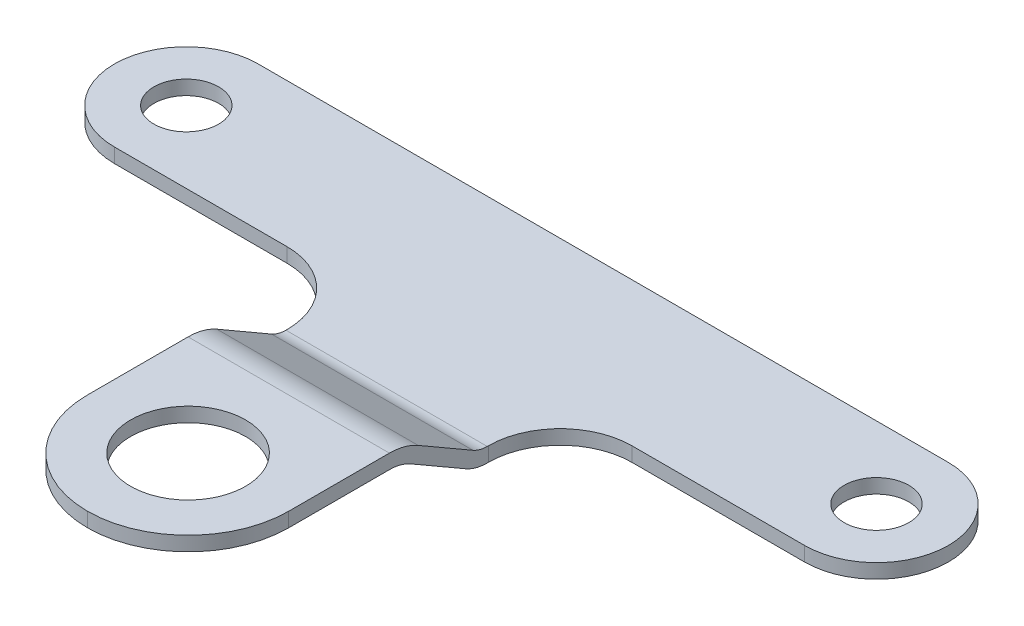
ISO-10303-21;
HEADER;
FILE_DESCRIPTION(('STEP AP214'),'2;1');
FILE_NAME('part.step','',(''),(''),'','','');
FILE_SCHEMA(('AUTOMOTIVE_DESIGN { 1 0 10303 214 1 1 1 1 }'));
ENDSEC;
DATA;
#1=APPLICATION_CONTEXT('core data for automotive mechanical design processes');
#2=APPLICATION_PROTOCOL_DEFINITION('international standard','automotive_design',2000,#1);
#3=PRODUCT_CONTEXT('',#1,'mechanical');
#4=PRODUCT('Part','Part','',(#3));
#5=PRODUCT_RELATED_PRODUCT_CATEGORY('part','',(#4));
#6=PRODUCT_DEFINITION_FORMATION('','',#4);
#7=PRODUCT_DEFINITION_CONTEXT('part definition',#1,'design');
#8=PRODUCT_DEFINITION('design','',#6,#7);
#9=PRODUCT_DEFINITION_SHAPE('','',#8);
#10=(LENGTH_UNIT() NAMED_UNIT(*) SI_UNIT(.MILLI.,.METRE.));
#11=(NAMED_UNIT(*) PLANE_ANGLE_UNIT() SI_UNIT($,.RADIAN.));
#12=(NAMED_UNIT(*) SI_UNIT($,.STERADIAN.) SOLID_ANGLE_UNIT());
#13=UNCERTAINTY_MEASURE_WITH_UNIT(LENGTH_MEASURE(1.E-05),#10,'distance_accuracy_value','');
#14=(GEOMETRIC_REPRESENTATION_CONTEXT(3) GLOBAL_UNCERTAINTY_ASSIGNED_CONTEXT((#13)) GLOBAL_UNIT_ASSIGNED_CONTEXT((#10,
#11,#12)) REPRESENTATION_CONTEXT('',''));
#15=CARTESIAN_POINT('',(0.,0.,0.));
#16=DIRECTION('',(0.,0.,1.));
#17=DIRECTION('',(1.,0.,0.));
#18=AXIS2_PLACEMENT_3D('',#15,#16,#17);
#19=CARTESIAN_POINT('',(7.,4.,21.8747822293042));
#20=DIRECTION('',(0.,-1.,0.));
#21=DIRECTION('',(0.,0.,-1.));
#22=AXIS2_PLACEMENT_3D('',#19,#20,#21);
#23=PLANE('',#22);
#24=CARTESIAN_POINT('',(0.,4.,28.8747822293042));
#25=DIRECTION('',(0.,-1.,0.));
#26=DIRECTION('',(0.,0.,-1.));
#27=AXIS2_PLACEMENT_3D('',#24,#25,#26);
#28=CIRCLE('',#27,4.);
#29=CARTESIAN_POINT('',(0.,4.,24.8747822293042));
#30=VERTEX_POINT('',#29);
#31=EDGE_CURVE('E238',#30,#30,#28,.F.);
#32=ORIENTED_EDGE('',*,*,#31,.F.);
#33=EDGE_LOOP('',(#32));
#34=FACE_BOUND('',#33,.T.);
#35=DIRECTION('',(0.,0.,1.));
#36=VECTOR('',#35,1.);
#37=CARTESIAN_POINT('',(-7.,4.,21.8747822293042));
#38=LINE('',#37,#36);
#39=CARTESIAN_POINT('',(-7.,4.,21.8747822293042));
#40=VERTEX_POINT('',#39);
#41=CARTESIAN_POINT('',(-7.,4.,28.8747822293042));
#42=VERTEX_POINT('',#41);
#43=EDGE_CURVE('E276',#40,#42,#38,.T.);
#44=ORIENTED_EDGE('',*,*,#43,.T.);
#45=CARTESIAN_POINT('',(0.,4.,28.8747822293042));
#46=DIRECTION('',(0.,-1.,0.));
#47=DIRECTION('',(0.,0.,-1.));
#48=AXIS2_PLACEMENT_3D('',#45,#46,#47);
#49=CIRCLE('',#48,7.);
#50=CARTESIAN_POINT('',(0.,3.99999999999999,35.8747822293042));
#51=VERTEX_POINT('',#50);
#52=EDGE_CURVE('E343',#42,#51,#49,.F.);
#53=ORIENTED_EDGE('',*,*,#52,.T.);
#54=CARTESIAN_POINT('',(0.,4.,28.8747822293042));
#55=DIRECTION('',(0.,-1.,0.));
#56=DIRECTION('',(0.,0.,-1.));
#57=AXIS2_PLACEMENT_3D('',#54,#55,#56);
#58=CIRCLE('',#57,7.);
#59=CARTESIAN_POINT('',(7.,4.,28.8747822293042));
#60=VERTEX_POINT('',#59);
#61=EDGE_CURVE('E340',#51,#60,#58,.F.);
#62=ORIENTED_EDGE('',*,*,#61,.T.);
#63=DIRECTION('',(0.,0.,1.));
#64=VECTOR('',#63,1.);
#65=CARTESIAN_POINT('',(7.,4.,21.8747822293042));
#66=LINE('',#65,#64);
#67=CARTESIAN_POINT('',(7.,4.,21.8747822293042));
#68=VERTEX_POINT('',#67);
#69=EDGE_CURVE('E243',#68,#60,#66,.T.);
#70=ORIENTED_EDGE('',*,*,#69,.F.);
#71=DIRECTION('',(-1.,0.,0.));
#72=VECTOR('',#71,1.);
#73=CARTESIAN_POINT('',(7.,4.,21.8747822293042));
#74=LINE('',#73,#72);
#75=EDGE_CURVE('E275',#68,#40,#74,.T.);
#76=ORIENTED_EDGE('',*,*,#75,.T.);
#77=EDGE_LOOP('',(#44,#53,#62,#70,#76));
#78=FACE_BOUND('',#77,.T.);
#79=ADVANCED_FACE('F41',(#34,#78),#23,.F.);
#80=CARTESIAN_POINT('',(7.,3.,21.8747822293042));
#81=DIRECTION('',(0.,-1.,0.));
#82=DIRECTION('',(0.,0.,-1.));
#83=AXIS2_PLACEMENT_3D('',#80,#81,#82);
#84=PLANE('',#83);
#85=CARTESIAN_POINT('',(0.,3.,28.8747822293042));
#86=DIRECTION('',(0.,-1.,0.));
#87=DIRECTION('',(0.,0.,-1.));
#88=AXIS2_PLACEMENT_3D('',#85,#86,#87);
#89=CIRCLE('',#88,4.);
#90=CARTESIAN_POINT('',(0.,3.,24.8747822293042));
#91=VERTEX_POINT('',#90);
#92=EDGE_CURVE('E232',#91,#91,#89,.F.);
#93=ORIENTED_EDGE('',*,*,#92,.T.);
#94=EDGE_LOOP('',(#93));
#95=FACE_BOUND('',#94,.T.);
#96=CARTESIAN_POINT('',(0.,3.,28.8747822293042));
#97=DIRECTION('',(0.,-1.,0.));
#98=DIRECTION('',(0.,0.,-1.));
#99=AXIS2_PLACEMENT_3D('',#96,#97,#98);
#100=CIRCLE('',#99,7.);
#101=CARTESIAN_POINT('',(7.,3.,28.8747822293042));
#102=VERTEX_POINT('',#101);
#103=CARTESIAN_POINT('',(0.,2.99999999999999,35.8747822293042));
#104=VERTEX_POINT('',#103);
#105=EDGE_CURVE('E346',#102,#104,#100,.T.);
#106=ORIENTED_EDGE('',*,*,#105,.T.);
#107=CARTESIAN_POINT('',(0.,3.,28.8747822293042));
#108=DIRECTION('',(0.,-1.,0.));
#109=DIRECTION('',(0.,0.,-1.));
#110=AXIS2_PLACEMENT_3D('',#107,#108,#109);
#111=CIRCLE('',#110,7.);
#112=CARTESIAN_POINT('',(-7.,3.,28.8747822293042));
#113=VERTEX_POINT('',#112);
#114=EDGE_CURVE('E349',#104,#113,#111,.T.);
#115=ORIENTED_EDGE('',*,*,#114,.T.);
#116=DIRECTION('',(0.,0.,1.));
#117=VECTOR('',#116,1.);
#118=CARTESIAN_POINT('',(-7.,3.,21.8747822293042));
#119=LINE('',#118,#117);
#120=CARTESIAN_POINT('',(-7.,3.,21.8747822293042));
#121=VERTEX_POINT('',#120);
#122=EDGE_CURVE('E280',#121,#113,#119,.T.);
#123=ORIENTED_EDGE('',*,*,#122,.F.);
#124=DIRECTION('',(-1.,0.,0.));
#125=VECTOR('',#124,1.);
#126=CARTESIAN_POINT('',(7.,3.,21.8747822293042));
#127=LINE('',#126,#125);
#128=CARTESIAN_POINT('',(7.,3.,21.8747822293042));
#129=VERTEX_POINT('',#128);
#130=EDGE_CURVE('E333',#129,#121,#127,.T.);
#131=ORIENTED_EDGE('',*,*,#130,.F.);
#132=DIRECTION('',(0.,0.,1.));
#133=VECTOR('',#132,1.);
#134=CARTESIAN_POINT('',(7.,3.,21.8747822293042));
#135=LINE('',#134,#133);
#136=EDGE_CURVE('E247',#129,#102,#135,.T.);
#137=ORIENTED_EDGE('',*,*,#136,.T.);
#138=EDGE_LOOP('',(#106,#115,#123,#131,#137));
#139=FACE_BOUND('',#138,.T.);
#140=ADVANCED_FACE('F392',(#95,#139),#84,.T.);
#141=CARTESIAN_POINT('',(7.,0.,21.8747822293042));
#142=DIRECTION('',(-1.,0.,0.));
#143=DIRECTION('',(0.,0.,1.));
#144=AXIS2_PLACEMENT_3D('',#141,#142,#143);
#145=CYLINDRICAL_SURFACE('',#144,3.);
#146=CARTESIAN_POINT('',(-7.,0.,21.8747822293042));
#147=DIRECTION('',(1.,0.,0.));
#148=DIRECTION('',(0.,0.,1.));
#149=AXIS2_PLACEMENT_3D('',#146,#147,#148);
#150=CIRCLE('',#149,3.);
#151=CARTESIAN_POINT('',(-7.,2.59807621135332,20.3747822293042));
#152=VERTEX_POINT('',#151);
#153=EDGE_CURVE('E284',#152,#121,#150,.T.);
#154=ORIENTED_EDGE('',*,*,#153,.F.);
#155=DIRECTION('',(-1.,0.,0.));
#156=VECTOR('',#155,1.);
#157=CARTESIAN_POINT('',(7.,2.59807621135332,20.3747822293042));
#158=LINE('',#157,#156);
#159=CARTESIAN_POINT('',(7.,2.59807621135332,20.3747822293042));
#160=VERTEX_POINT('',#159);
#161=EDGE_CURVE('E330',#160,#152,#158,.T.);
#162=ORIENTED_EDGE('',*,*,#161,.F.);
#163=CARTESIAN_POINT('',(7.,0.,21.8747822293042));
#164=DIRECTION('',(1.,0.,0.));
#165=DIRECTION('',(0.,0.,1.));
#166=AXIS2_PLACEMENT_3D('',#163,#164,#165);
#167=CIRCLE('',#166,3.);
#168=EDGE_CURVE('E252',#160,#129,#167,.T.);
#169=ORIENTED_EDGE('',*,*,#168,.T.);
#170=ORIENTED_EDGE('',*,*,#130,.T.);
#171=EDGE_LOOP('',(#154,#162,#169,#170));
#172=FACE_BOUND('',#171,.T.);
#173=ADVANCED_FACE('F398',(#172),#145,.F.);
#174=CARTESIAN_POINT('',(7.,2.59807621135332,20.3747822293042));
#175=DIRECTION('',(0.,-0.866025403784442,0.499999999999994));
#176=DIRECTION('',(0.,-0.499999999999995,-0.866025403784442));
#177=AXIS2_PLACEMENT_3D('',#174,#175,#176);
#178=PLANE('',#177);
#179=DIRECTION('',(0.,0.499999999999994,0.866025403784442));
#180=VECTOR('',#179,1.);
#181=CARTESIAN_POINT('',(-7.,2.59807621135332,20.3747822293042));
#182=LINE('',#181,#180);
#183=CARTESIAN_POINT('',(-7.,0.401923788646672,16.5709346520108));
#184=VERTEX_POINT('',#183);
#185=EDGE_CURVE('E287',#184,#152,#182,.T.);
#186=ORIENTED_EDGE('',*,*,#185,.F.);
#187=DIRECTION('',(-1.,0.,0.));
#188=VECTOR('',#187,1.);
#189=CARTESIAN_POINT('',(7.,0.401923788646672,16.5709346520108));
#190=LINE('',#189,#188);
#191=CARTESIAN_POINT('',(7.,0.401923788646672,16.5709346520108));
#192=VERTEX_POINT('',#191);
#193=EDGE_CURVE('E327',#192,#184,#190,.T.);
#194=ORIENTED_EDGE('',*,*,#193,.F.);
#195=DIRECTION('',(0.,0.499999999999994,0.866025403784442));
#196=VECTOR('',#195,1.);
#197=CARTESIAN_POINT('',(7.,2.59807621135332,20.3747822293042));
#198=LINE('',#197,#196);
#199=EDGE_CURVE('E256',#192,#160,#198,.T.);
#200=ORIENTED_EDGE('',*,*,#199,.T.);
#201=ORIENTED_EDGE('',*,*,#161,.T.);
#202=EDGE_LOOP('',(#186,#194,#200,#201));
#203=FACE_BOUND('',#202,.T.);
#204=ADVANCED_FACE('F474',(#203),#178,.T.);
#205=CARTESIAN_POINT('',(7.,3.,15.0709346520108));
#206=DIRECTION('',(-1.,0.,0.));
#207=DIRECTION('',(0.,0.,1.));
#208=AXIS2_PLACEMENT_3D('',#205,#206,#207);
#209=CYLINDRICAL_SURFACE('',#208,3.);
#210=CARTESIAN_POINT('',(-7.,3.,15.0709346520108));
#211=DIRECTION('',(-1.,0.,0.));
#212=DIRECTION('',(0.,0.,1.));
#213=AXIS2_PLACEMENT_3D('',#210,#211,#212);
#214=CIRCLE('',#213,3.);
#215=CARTESIAN_POINT('',(-7.,0.,15.0709346520108));
#216=VERTEX_POINT('',#215);
#217=EDGE_CURVE('E290',#216,#184,#214,.T.);
#218=ORIENTED_EDGE('',*,*,#217,.F.);
#219=DIRECTION('',(-1.,0.,0.));
#220=VECTOR('',#219,1.);
#221=CARTESIAN_POINT('',(7.,0.,15.0709346520108));
#222=LINE('',#221,#220);
#223=CARTESIAN_POINT('',(7.,0.,15.0709346520108));
#224=VERTEX_POINT('',#223);
#225=EDGE_CURVE('E323',#224,#216,#222,.T.);
#226=ORIENTED_EDGE('',*,*,#225,.F.);
#227=CARTESIAN_POINT('',(7.,3.,15.0709346520108));
#228=DIRECTION('',(-1.,0.,0.));
#229=DIRECTION('',(0.,0.,1.));
#230=AXIS2_PLACEMENT_3D('',#227,#228,#229);
#231=CIRCLE('',#230,3.);
#232=EDGE_CURVE('E260',#224,#192,#231,.T.);
#233=ORIENTED_EDGE('',*,*,#232,.T.);
#234=ORIENTED_EDGE('',*,*,#193,.T.);
#235=EDGE_LOOP('',(#218,#226,#233,#234));
#236=FACE_BOUND('',#235,.T.);
#237=ADVANCED_FACE('F468',(#236),#209,.T.);
#238=CARTESIAN_POINT('',(7.,0.,0.));
#239=DIRECTION('',(0.,-1.,0.));
#240=DIRECTION('',(0.,0.,-1.));
#241=AXIS2_PLACEMENT_3D('',#238,#239,#240);
#242=PLANE('',#241);
#243=DIRECTION('',(0.,0.,1.));
#244=VECTOR('',#243,1.);
#245=CARTESIAN_POINT('',(-7.,0.,0.));
#246=LINE('',#245,#244);
#247=CARTESIAN_POINT('',(-7.,0.,15.));
#248=VERTEX_POINT('',#247);
#249=EDGE_CURVE('E293',#248,#216,#246,.T.);
#250=ORIENTED_EDGE('',*,*,#249,.F.);
#251=CARTESIAN_POINT('',(-12.,0.,15.));
#252=DIRECTION('',(0.,-1.,0.));
#253=DIRECTION('',(0.,0.,-1.));
#254=AXIS2_PLACEMENT_3D('',#251,#252,#253);
#255=CIRCLE('',#254,5.);
#256=CARTESIAN_POINT('',(-12.,0.,10.));
#257=VERTEX_POINT('',#256);
#258=EDGE_CURVE('E49',#248,#257,#255,.F.);
#259=ORIENTED_EDGE('',*,*,#258,.T.);
#260=DIRECTION('',(-1.,0.,0.));
#261=VECTOR('',#260,1.);
#262=CARTESIAN_POINT('',(24.,0.,10.));
#263=LINE('',#262,#261);
#264=CARTESIAN_POINT('',(-24.,0.,10.));
#265=VERTEX_POINT('',#264);
#266=EDGE_CURVE('E227',#257,#265,#263,.T.);
#267=ORIENTED_EDGE('',*,*,#266,.T.);
#268=CARTESIAN_POINT('',(-24.,0.,5.));
#269=DIRECTION('',(0.,-1.,0.));
#270=DIRECTION('',(0.,0.,-1.));
#271=AXIS2_PLACEMENT_3D('',#268,#269,#270);
#272=CIRCLE('',#271,5.);
#273=CARTESIAN_POINT('',(-24.,0.,0.));
#274=VERTEX_POINT('',#273);
#275=EDGE_CURVE('E213',#265,#274,#272,.T.);
#276=ORIENTED_EDGE('',*,*,#275,.T.);
#277=DIRECTION('',(-1.,0.,0.));
#278=VECTOR('',#277,1.);
#279=CARTESIAN_POINT('',(7.,0.,0.));
#280=LINE('',#279,#278);
#281=CARTESIAN_POINT('',(24.,0.,0.));
#282=VERTEX_POINT('',#281);
#283=EDGE_CURVE('E320',#282,#274,#280,.T.);
#284=ORIENTED_EDGE('',*,*,#283,.F.);
#285=CARTESIAN_POINT('',(24.,0.,5.));
#286=DIRECTION('',(0.,-1.,0.));
#287=DIRECTION('',(0.,0.,-1.));
#288=AXIS2_PLACEMENT_3D('',#285,#286,#287);
#289=CIRCLE('',#288,5.);
#290=CARTESIAN_POINT('',(24.,0.,10.));
#291=VERTEX_POINT('',#290);
#292=EDGE_CURVE('E225',#282,#291,#289,.T.);
#293=ORIENTED_EDGE('',*,*,#292,.T.);
#294=CARTESIAN_POINT('',(12.,0.,10.));
#295=VERTEX_POINT('',#294);
#296=EDGE_CURVE('E188',#291,#295,#263,.T.);
#297=ORIENTED_EDGE('',*,*,#296,.T.);
#298=CARTESIAN_POINT('',(12.,0.,15.));
#299=DIRECTION('',(0.,-1.,0.));
#300=DIRECTION('',(0.,0.,-1.));
#301=AXIS2_PLACEMENT_3D('',#298,#299,#300);
#302=CIRCLE('',#301,5.);
#303=CARTESIAN_POINT('',(7.,0.,15.));
#304=VERTEX_POINT('',#303);
#305=EDGE_CURVE('E368',#295,#304,#302,.F.);
#306=ORIENTED_EDGE('',*,*,#305,.T.);
#307=DIRECTION('',(0.,0.,1.));
#308=VECTOR('',#307,1.);
#309=CARTESIAN_POINT('',(7.,0.,0.));
#310=LINE('',#309,#308);
#311=EDGE_CURVE('E263',#304,#224,#310,.T.);
#312=ORIENTED_EDGE('',*,*,#311,.T.);
#313=ORIENTED_EDGE('',*,*,#225,.T.);
#314=EDGE_LOOP('',(#250,#259,#267,#276,#284,#293,#297,#306,#312,#313));
#315=FACE_BOUND('',#314,.T.);
#316=CARTESIAN_POINT('',(-24.,0.,5.));
#317=DIRECTION('',(0.,-1.,0.));
#318=DIRECTION('',(0.,0.,-1.));
#319=AXIS2_PLACEMENT_3D('',#316,#317,#318);
#320=CIRCLE('',#319,2.25);
#321=CARTESIAN_POINT('',(-24.,0.,2.75));
#322=VERTEX_POINT('',#321);
#323=EDGE_CURVE('E661',#322,#322,#320,.T.);
#324=ORIENTED_EDGE('',*,*,#323,.F.);
#325=EDGE_LOOP('',(#324));
#326=FACE_BOUND('',#325,.T.);
#327=CARTESIAN_POINT('',(24.,0.,5.));
#328=DIRECTION('',(0.,-1.,0.));
#329=DIRECTION('',(0.,0.,-1.));
#330=AXIS2_PLACEMENT_3D('',#327,#328,#329);
#331=CIRCLE('',#330,2.25);
#332=CARTESIAN_POINT('',(24.,0.,2.75));
#333=VERTEX_POINT('',#332);
#334=EDGE_CURVE('E220',#333,#333,#331,.T.);
#335=ORIENTED_EDGE('',*,*,#334,.F.);
#336=EDGE_LOOP('',(#335));
#337=FACE_BOUND('',#336,.T.);
#338=ADVANCED_FACE('F371',(#315,#326,#337),#242,.T.);
#339=CARTESIAN_POINT('',(7.,1.,0.));
#340=DIRECTION('',(0.,0.,-1.));
#341=DIRECTION('',(0.,1.,0.));
#342=AXIS2_PLACEMENT_3D('',#339,#340,#341);
#343=PLANE('',#342);
#344=ORIENTED_EDGE('',*,*,#283,.T.);
#345=DIRECTION('',(0.,-1.,0.));
#346=VECTOR('',#345,1.);
#347=CARTESIAN_POINT('',(-24.,1.,0.));
#348=LINE('',#347,#346);
#349=CARTESIAN_POINT('',(-24.,1.,0.));
#350=VERTEX_POINT('',#349);
#351=EDGE_CURVE('E233',#350,#274,#348,.T.);
#352=ORIENTED_EDGE('',*,*,#351,.F.);
#353=DIRECTION('',(-1.,0.,0.));
#354=VECTOR('',#353,1.);
#355=CARTESIAN_POINT('',(7.,1.,0.));
#356=LINE('',#355,#354);
#357=CARTESIAN_POINT('',(24.,1.,0.));
#358=VERTEX_POINT('',#357);
#359=EDGE_CURVE('E317',#358,#350,#356,.T.);
#360=ORIENTED_EDGE('',*,*,#359,.F.);
#361=DIRECTION('',(0.,-1.,0.));
#362=VECTOR('',#361,1.);
#363=CARTESIAN_POINT('',(24.,1.,0.));
#364=LINE('',#363,#362);
#365=EDGE_CURVE('E211',#358,#282,#364,.T.);
#366=ORIENTED_EDGE('',*,*,#365,.T.);
#367=EDGE_LOOP('',(#344,#352,#360,#366));
#368=FACE_BOUND('',#367,.T.);
#369=ADVANCED_FACE('F460',(#368),#343,.T.);
#370=CARTESIAN_POINT('',(7.,1.,0.));
#371=DIRECTION('',(0.,-1.,0.));
#372=DIRECTION('',(0.,0.,-1.));
#373=AXIS2_PLACEMENT_3D('',#370,#371,#372);
#374=PLANE('',#373);
#375=DIRECTION('',(0.,0.,1.));
#376=VECTOR('',#375,1.);
#377=CARTESIAN_POINT('',(7.,1.,0.));
#378=LINE('',#377,#376);
#379=CARTESIAN_POINT('',(7.,0.999999999999998,15.));
#380=VERTEX_POINT('',#379);
#381=CARTESIAN_POINT('',(7.,0.999999999999999,15.0709346520108));
#382=VERTEX_POINT('',#381);
#383=EDGE_CURVE('E265',#380,#382,#378,.T.);
#384=ORIENTED_EDGE('',*,*,#383,.F.);
#385=CARTESIAN_POINT('',(12.,0.999999999999998,15.));
#386=DIRECTION('',(0.,-1.,0.));
#387=DIRECTION('',(0.,0.,-1.));
#388=AXIS2_PLACEMENT_3D('',#385,#386,#387);
#389=CIRCLE('',#388,5.);
#390=CARTESIAN_POINT('',(12.,0.999999999999999,10.));
#391=VERTEX_POINT('',#390);
#392=EDGE_CURVE('E204',#380,#391,#389,.T.);
#393=ORIENTED_EDGE('',*,*,#392,.T.);
#394=DIRECTION('',(-1.,0.,0.));
#395=VECTOR('',#394,1.);
#396=CARTESIAN_POINT('',(24.,0.999999999999999,10.));
#397=LINE('',#396,#395);
#398=CARTESIAN_POINT('',(24.,0.999999999999999,10.));
#399=VERTEX_POINT('',#398);
#400=EDGE_CURVE('E185',#399,#391,#397,.T.);
#401=ORIENTED_EDGE('',*,*,#400,.F.);
#402=CARTESIAN_POINT('',(24.,0.999999999999999,5.));
#403=DIRECTION('',(0.,-1.,0.));
#404=DIRECTION('',(0.,0.,-1.));
#405=AXIS2_PLACEMENT_3D('',#402,#403,#404);
#406=CIRCLE('',#405,5.);
#407=EDGE_CURVE('E202',#358,#399,#406,.T.);
#408=ORIENTED_EDGE('',*,*,#407,.F.);
#409=ORIENTED_EDGE('',*,*,#359,.T.);
#410=CARTESIAN_POINT('',(-24.,0.999999999999999,5.));
#411=DIRECTION('',(0.,-1.,0.));
#412=DIRECTION('',(0.,0.,-1.));
#413=AXIS2_PLACEMENT_3D('',#410,#411,#412);
#414=CIRCLE('',#413,5.);
#415=CARTESIAN_POINT('',(-24.,0.999999999999999,10.));
#416=VERTEX_POINT('',#415);
#417=EDGE_CURVE('E195',#416,#350,#414,.T.);
#418=ORIENTED_EDGE('',*,*,#417,.F.);
#419=CARTESIAN_POINT('',(-12.,0.999999999999999,10.));
#420=VERTEX_POINT('',#419);
#421=EDGE_CURVE('E206',#420,#416,#397,.T.);
#422=ORIENTED_EDGE('',*,*,#421,.F.);
#423=CARTESIAN_POINT('',(-12.,0.999999999999998,15.));
#424=DIRECTION('',(0.,-1.,0.));
#425=DIRECTION('',(0.,0.,-1.));
#426=AXIS2_PLACEMENT_3D('',#423,#424,#425);
#427=CIRCLE('',#426,5.);
#428=CARTESIAN_POINT('',(-7.,0.999999999999998,15.));
#429=VERTEX_POINT('',#428);
#430=EDGE_CURVE('E11',#420,#429,#427,.T.);
#431=ORIENTED_EDGE('',*,*,#430,.T.);
#432=DIRECTION('',(0.,0.,1.));
#433=VECTOR('',#432,1.);
#434=CARTESIAN_POINT('',(-7.,1.,0.));
#435=LINE('',#434,#433);
#436=CARTESIAN_POINT('',(-7.,0.999999999999999,15.0709346520108));
#437=VERTEX_POINT('',#436);
#438=EDGE_CURVE('E295',#429,#437,#435,.T.);
#439=ORIENTED_EDGE('',*,*,#438,.T.);
#440=DIRECTION('',(-1.,0.,0.));
#441=VECTOR('',#440,1.);
#442=CARTESIAN_POINT('',(7.,0.999999999999999,15.0709346520108));
#443=LINE('',#442,#441);
#444=EDGE_CURVE('E313',#382,#437,#443,.T.);
#445=ORIENTED_EDGE('',*,*,#444,.F.);
#446=EDGE_LOOP('',(#384,#393,#401,#408,#409,#418,#422,#431,#439,#445));
#447=FACE_BOUND('',#446,.T.);
#448=CARTESIAN_POINT('',(-24.,0.999999999999999,5.));
#449=DIRECTION('',(0.,-1.,0.));
#450=DIRECTION('',(0.,0.,-1.));
#451=AXIS2_PLACEMENT_3D('',#448,#449,#450);
#452=CIRCLE('',#451,2.25);
#453=CARTESIAN_POINT('',(-24.,1.,2.75));
#454=VERTEX_POINT('',#453);
#455=EDGE_CURVE('E658',#454,#454,#452,.T.);
#456=ORIENTED_EDGE('',*,*,#455,.T.);
#457=EDGE_LOOP('',(#456));
#458=FACE_BOUND('',#457,.T.);
#459=CARTESIAN_POINT('',(24.,0.999999999999999,5.));
#460=DIRECTION('',(0.,-1.,0.));
#461=DIRECTION('',(0.,0.,-1.));
#462=AXIS2_PLACEMENT_3D('',#459,#460,#461);
#463=CIRCLE('',#462,2.25);
#464=CARTESIAN_POINT('',(24.,1.,2.75));
#465=VERTEX_POINT('',#464);
#466=EDGE_CURVE('E228',#465,#465,#463,.T.);
#467=ORIENTED_EDGE('',*,*,#466,.T.);
#468=EDGE_LOOP('',(#467));
#469=FACE_BOUND('',#468,.T.);
#470=ADVANCED_FACE('F200',(#447,#458,#469),#374,.F.);
#471=CARTESIAN_POINT('',(7.,3.,15.0709346520108));
#472=DIRECTION('',(-1.,0.,0.));
#473=DIRECTION('',(0.,0.,1.));
#474=AXIS2_PLACEMENT_3D('',#471,#472,#473);
#475=CYLINDRICAL_SURFACE('',#474,2.);
#476=CARTESIAN_POINT('',(-7.,3.,15.0709346520108));
#477=DIRECTION('',(1.,0.,0.));
#478=DIRECTION('',(0.,0.,-1.));
#479=AXIS2_PLACEMENT_3D('',#476,#477,#478);
#480=CIRCLE('',#479,2.);
#481=CARTESIAN_POINT('',(-7.,1.26794919243112,16.0709346520108));
#482=VERTEX_POINT('',#481);
#483=EDGE_CURVE('E297',#437,#482,#480,.F.);
#484=ORIENTED_EDGE('',*,*,#483,.T.);
#485=DIRECTION('',(-1.,0.,0.));
#486=VECTOR('',#485,1.);
#487=CARTESIAN_POINT('',(7.,1.26794919243112,16.0709346520108));
#488=LINE('',#487,#486);
#489=CARTESIAN_POINT('',(7.,1.26794919243112,16.0709346520108));
#490=VERTEX_POINT('',#489);
#491=EDGE_CURVE('E309',#490,#482,#488,.T.);
#492=ORIENTED_EDGE('',*,*,#491,.F.);
#493=CARTESIAN_POINT('',(7.,3.,15.0709346520108));
#494=DIRECTION('',(1.,0.,0.));
#495=DIRECTION('',(0.,0.,-1.));
#496=AXIS2_PLACEMENT_3D('',#493,#494,#495);
#497=CIRCLE('',#496,2.);
#498=EDGE_CURVE('E267',#382,#490,#497,.F.);
#499=ORIENTED_EDGE('',*,*,#498,.F.);
#500=ORIENTED_EDGE('',*,*,#444,.T.);
#501=EDGE_LOOP('',(#484,#492,#499,#500));
#502=FACE_BOUND('',#501,.T.);
#503=ADVANCED_FACE('F448',(#502),#475,.F.);
#504=CARTESIAN_POINT('',(7.,3.46410161513776,19.8747822293042));
#505=DIRECTION('',(0.,-0.866025403784442,0.499999999999994));
#506=DIRECTION('',(0.,-0.499999999999994,-0.866025403784442));
#507=AXIS2_PLACEMENT_3D('',#504,#505,#506);
#508=PLANE('',#507);
#509=DIRECTION('',(0.,0.499999999999995,0.866025403784442));
#510=VECTOR('',#509,1.);
#511=CARTESIAN_POINT('',(-7.,3.46410161513776,19.8747822293042));
#512=LINE('',#511,#510);
#513=CARTESIAN_POINT('',(-7.,3.46410161513776,19.8747822293042));
#514=VERTEX_POINT('',#513);
#515=EDGE_CURVE('E299',#482,#514,#512,.T.);
#516=ORIENTED_EDGE('',*,*,#515,.T.);
#517=DIRECTION('',(-1.,0.,0.));
#518=VECTOR('',#517,1.);
#519=CARTESIAN_POINT('',(7.,3.46410161513776,19.8747822293042));
#520=LINE('',#519,#518);
#521=CARTESIAN_POINT('',(7.,3.46410161513776,19.8747822293042));
#522=VERTEX_POINT('',#521);
#523=EDGE_CURVE('E305',#522,#514,#520,.T.);
#524=ORIENTED_EDGE('',*,*,#523,.F.);
#525=DIRECTION('',(0.,0.499999999999995,0.866025403784442));
#526=VECTOR('',#525,1.);
#527=CARTESIAN_POINT('',(7.,3.46410161513776,19.8747822293042));
#528=LINE('',#527,#526);
#529=EDGE_CURVE('E269',#490,#522,#528,.T.);
#530=ORIENTED_EDGE('',*,*,#529,.F.);
#531=ORIENTED_EDGE('',*,*,#491,.T.);
#532=EDGE_LOOP('',(#516,#524,#530,#531));
#533=FACE_BOUND('',#532,.T.);
#534=ADVANCED_FACE('F444',(#533),#508,.F.);
#535=CARTESIAN_POINT('',(7.,0.,21.8747822293042));
#536=DIRECTION('',(-1.,0.,0.));
#537=DIRECTION('',(0.,0.,1.));
#538=AXIS2_PLACEMENT_3D('',#535,#536,#537);
#539=CYLINDRICAL_SURFACE('',#538,4.);
#540=CARTESIAN_POINT('',(-7.,0.,21.8747822293042));
#541=DIRECTION('',(1.,0.,0.));
#542=DIRECTION('',(0.,0.,-1.));
#543=AXIS2_PLACEMENT_3D('',#540,#541,#542);
#544=CIRCLE('',#543,4.);
#545=EDGE_CURVE('E248',#514,#40,#544,.T.);
#546=ORIENTED_EDGE('',*,*,#545,.T.);
#547=ORIENTED_EDGE('',*,*,#75,.F.);
#548=CARTESIAN_POINT('',(7.,0.,21.8747822293042));
#549=DIRECTION('',(1.,0.,0.));
#550=DIRECTION('',(0.,0.,-1.));
#551=AXIS2_PLACEMENT_3D('',#548,#549,#550);
#552=CIRCLE('',#551,4.);
#553=EDGE_CURVE('E272',#522,#68,#552,.T.);
#554=ORIENTED_EDGE('',*,*,#553,.F.);
#555=ORIENTED_EDGE('',*,*,#523,.T.);
#556=EDGE_LOOP('',(#546,#547,#554,#555));
#557=FACE_BOUND('',#556,.T.);
#558=ADVANCED_FACE('F440',(#557),#539,.T.);
#559=CARTESIAN_POINT('',(7.,0.,21.8747822293042));
#560=DIRECTION('',(1.,0.,0.));
#561=DIRECTION('',(0.,0.,-1.));
#562=AXIS2_PLACEMENT_3D('',#559,#560,#561);
#563=PLANE('',#562);
#564=ORIENTED_EDGE('',*,*,#311,.F.);
#565=DIRECTION('',(0.,-1.,0.));
#566=VECTOR('',#565,1.);
#567=CARTESIAN_POINT('',(7.,0.999999999999998,15.));
#568=LINE('',#567,#566);
#569=EDGE_CURVE('E362',#304,#380,#568,.F.);
#570=ORIENTED_EDGE('',*,*,#569,.T.);
#571=ORIENTED_EDGE('',*,*,#383,.T.);
#572=ORIENTED_EDGE('',*,*,#498,.T.);
#573=ORIENTED_EDGE('',*,*,#529,.T.);
#574=ORIENTED_EDGE('',*,*,#553,.T.);
#575=ORIENTED_EDGE('',*,*,#69,.T.);
#576=DIRECTION('',(0.,1.,0.));
#577=VECTOR('',#576,1.);
#578=CARTESIAN_POINT('',(7.,0.,28.8747822293042));
#579=LINE('',#578,#577);
#580=EDGE_CURVE('E351',#60,#102,#579,.F.);
#581=ORIENTED_EDGE('',*,*,#580,.T.);
#582=ORIENTED_EDGE('',*,*,#136,.F.);
#583=ORIENTED_EDGE('',*,*,#168,.F.);
#584=ORIENTED_EDGE('',*,*,#199,.F.);
#585=ORIENTED_EDGE('',*,*,#232,.F.);
#586=EDGE_LOOP('',(#564,#570,#571,#572,#573,#574,#575,#581,#582,#583,#584,#585));
#587=FACE_BOUND('',#586,.T.);
#588=ADVANCED_FACE('F378',(#587),#563,.T.);
#589=CARTESIAN_POINT('',(-7.,0.,21.8747822293042));
#590=DIRECTION('',(1.,0.,0.));
#591=DIRECTION('',(0.,0.,-1.));
#592=AXIS2_PLACEMENT_3D('',#589,#590,#591);
#593=PLANE('',#592);
#594=ORIENTED_EDGE('',*,*,#438,.F.);
#595=DIRECTION('',(0.,-1.,0.));
#596=VECTOR('',#595,1.);
#597=CARTESIAN_POINT('',(-7.,0.,15.));
#598=LINE('',#597,#596);
#599=EDGE_CURVE('E364',#429,#248,#598,.T.);
#600=ORIENTED_EDGE('',*,*,#599,.T.);
#601=ORIENTED_EDGE('',*,*,#249,.T.);
#602=ORIENTED_EDGE('',*,*,#217,.T.);
#603=ORIENTED_EDGE('',*,*,#185,.T.);
#604=ORIENTED_EDGE('',*,*,#153,.T.);
#605=ORIENTED_EDGE('',*,*,#122,.T.);
#606=DIRECTION('',(0.,1.,0.));
#607=VECTOR('',#606,1.);
#608=CARTESIAN_POINT('',(-7.,3.99999999999999,28.8747822293042));
#609=LINE('',#608,#607);
#610=EDGE_CURVE('E336',#113,#42,#609,.T.);
#611=ORIENTED_EDGE('',*,*,#610,.T.);
#612=ORIENTED_EDGE('',*,*,#43,.F.);
#613=ORIENTED_EDGE('',*,*,#545,.F.);
#614=ORIENTED_EDGE('',*,*,#515,.F.);
#615=ORIENTED_EDGE('',*,*,#483,.F.);
#616=EDGE_LOOP('',(#594,#600,#601,#602,#603,#604,#605,#611,#612,#613,#614,#615));
#617=FACE_BOUND('',#616,.T.);
#618=ADVANCED_FACE('F411',(#617),#593,.F.);
#619=CARTESIAN_POINT('',(0.,2.99999999999999,28.8747822293042));
#620=DIRECTION('',(0.,1.,0.));
#621=DIRECTION('',(0.,0.,1.));
#622=AXIS2_PLACEMENT_3D('',#619,#620,#621);
#623=CYLINDRICAL_SURFACE('',#622,7.);
#624=DIRECTION('',(0.,1.,0.));
#625=VECTOR('',#624,1.);
#626=CARTESIAN_POINT('',(0.,2.99999999999999,35.8747822293042));
#627=LINE('',#626,#625);
#628=EDGE_CURVE('E242',#104,#51,#627,.T.);
#629=ORIENTED_EDGE('',*,*,#628,.F.);
#630=ORIENTED_EDGE('',*,*,#105,.F.);
#631=ORIENTED_EDGE('',*,*,#580,.F.);
#632=ORIENTED_EDGE('',*,*,#61,.F.);
#633=EDGE_LOOP('',(#629,#630,#631,#632));
#634=FACE_BOUND('',#633,.T.);
#635=ADVANCED_FACE('F408',(#634),#623,.T.);
#636=CARTESIAN_POINT('',(0.,0.,28.8747822293042));
#637=DIRECTION('',(0.,-1.,0.));
#638=DIRECTION('',(0.,0.,-1.));
#639=AXIS2_PLACEMENT_3D('',#636,#637,#638);
#640=CYLINDRICAL_SURFACE('',#639,7.);
#641=ORIENTED_EDGE('',*,*,#114,.F.);
#642=ORIENTED_EDGE('',*,*,#628,.T.);
#643=ORIENTED_EDGE('',*,*,#52,.F.);
#644=ORIENTED_EDGE('',*,*,#610,.F.);
#645=EDGE_LOOP('',(#641,#642,#643,#644));
#646=FACE_BOUND('',#645,.T.);
#647=ADVANCED_FACE('F405',(#646),#640,.T.);
#648=CARTESIAN_POINT('',(0.,11.,28.8747822293042));
#649=DIRECTION('',(0.,-1.,0.));
#650=DIRECTION('',(0.,0.,-1.));
#651=AXIS2_PLACEMENT_3D('',#648,#649,#650);
#652=CYLINDRICAL_SURFACE('',#651,4.);
#653=ORIENTED_EDGE('',*,*,#92,.F.);
#654=EDGE_LOOP('',(#653));
#655=FACE_BOUND('',#654,.T.);
#656=ORIENTED_EDGE('',*,*,#31,.T.);
#657=EDGE_LOOP('',(#656));
#658=FACE_BOUND('',#657,.T.);
#659=ADVANCED_FACE('F407',(#655,#658),#652,.F.);
#660=CARTESIAN_POINT('',(-24.,0.999999999999999,5.));
#661=DIRECTION('',(0.,-1.,0.));
#662=DIRECTION('',(0.,0.,-1.));
#663=AXIS2_PLACEMENT_3D('',#660,#661,#662);
#664=CYLINDRICAL_SURFACE('',#663,5.);
#665=ORIENTED_EDGE('',*,*,#275,.F.);
#666=DIRECTION('',(0.,-1.,0.));
#667=VECTOR('',#666,1.);
#668=CARTESIAN_POINT('',(-24.,0.999999999999999,10.));
#669=LINE('',#668,#667);
#670=EDGE_CURVE('E194',#416,#265,#669,.T.);
#671=ORIENTED_EDGE('',*,*,#670,.F.);
#672=ORIENTED_EDGE('',*,*,#417,.T.);
#673=ORIENTED_EDGE('',*,*,#351,.T.);
#674=EDGE_LOOP('',(#665,#671,#672,#673));
#675=FACE_BOUND('',#674,.T.);
#676=ADVANCED_FACE('F457',(#675),#664,.T.);
#677=CARTESIAN_POINT('',(-24.,0.999999999999999,5.));
#678=DIRECTION('',(0.,-1.,0.));
#679=DIRECTION('',(0.,0.,-1.));
#680=AXIS2_PLACEMENT_3D('',#677,#678,#679);
#681=CYLINDRICAL_SURFACE('',#680,2.25);
#682=ORIENTED_EDGE('',*,*,#455,.F.);
#683=EDGE_LOOP('',(#682));
#684=FACE_BOUND('',#683,.T.);
#685=ORIENTED_EDGE('',*,*,#323,.T.);
#686=EDGE_LOOP('',(#685));
#687=FACE_BOUND('',#686,.T.);
#688=ADVANCED_FACE('F595',(#684,#687),#681,.F.);
#689=CARTESIAN_POINT('',(24.,0.999999999999999,10.));
#690=DIRECTION('',(0.,0.,1.));
#691=DIRECTION('',(0.,-1.,0.));
#692=AXIS2_PLACEMENT_3D('',#689,#690,#691);
#693=PLANE('',#692);
#694=ORIENTED_EDGE('',*,*,#266,.F.);
#695=DIRECTION('',(0.,-1.,0.));
#696=VECTOR('',#695,1.);
#697=CARTESIAN_POINT('',(-12.,0.999999999999999,10.));
#698=LINE('',#697,#696);
#699=EDGE_CURVE('E62',#257,#420,#698,.F.);
#700=ORIENTED_EDGE('',*,*,#699,.T.);
#701=ORIENTED_EDGE('',*,*,#421,.T.);
#702=ORIENTED_EDGE('',*,*,#670,.T.);
#703=EDGE_LOOP('',(#694,#700,#701,#702));
#704=FACE_BOUND('',#703,.T.);
#705=ADVANCED_FACE('F454',(#704),#693,.T.);
#706=CARTESIAN_POINT('',(24.,0.999999999999999,5.));
#707=DIRECTION('',(0.,-1.,0.));
#708=DIRECTION('',(0.,0.,-1.));
#709=AXIS2_PLACEMENT_3D('',#706,#707,#708);
#710=CYLINDRICAL_SURFACE('',#709,5.);
#711=ORIENTED_EDGE('',*,*,#292,.F.);
#712=ORIENTED_EDGE('',*,*,#365,.F.);
#713=ORIENTED_EDGE('',*,*,#407,.T.);
#714=DIRECTION('',(0.,-1.,0.));
#715=VECTOR('',#714,1.);
#716=CARTESIAN_POINT('',(24.,0.999999999999999,10.));
#717=LINE('',#716,#715);
#718=EDGE_CURVE('E181',#399,#291,#717,.T.);
#719=ORIENTED_EDGE('',*,*,#718,.T.);
#720=EDGE_LOOP('',(#711,#712,#713,#719));
#721=FACE_BOUND('',#720,.T.);
#722=ADVANCED_FACE('F209',(#721),#710,.T.);
#723=ORIENTED_EDGE('',*,*,#400,.T.);
#724=DIRECTION('',(0.,-1.,0.));
#725=VECTOR('',#724,1.);
#726=CARTESIAN_POINT('',(12.,0.,10.));
#727=LINE('',#726,#725);
#728=EDGE_CURVE('E354',#391,#295,#727,.T.);
#729=ORIENTED_EDGE('',*,*,#728,.T.);
#730=ORIENTED_EDGE('',*,*,#296,.F.);
#731=ORIENTED_EDGE('',*,*,#718,.F.);
#732=EDGE_LOOP('',(#723,#729,#730,#731));
#733=FACE_BOUND('',#732,.T.);
#734=ADVANCED_FACE('F183',(#733),#693,.T.);
#735=CARTESIAN_POINT('',(24.,0.999999999999999,5.));
#736=DIRECTION('',(0.,-1.,0.));
#737=DIRECTION('',(0.,0.,-1.));
#738=AXIS2_PLACEMENT_3D('',#735,#736,#737);
#739=CYLINDRICAL_SURFACE('',#738,2.25);
#740=ORIENTED_EDGE('',*,*,#466,.F.);
#741=EDGE_LOOP('',(#740));
#742=FACE_BOUND('',#741,.T.);
#743=ORIENTED_EDGE('',*,*,#334,.T.);
#744=EDGE_LOOP('',(#743));
#745=FACE_BOUND('',#744,.T.);
#746=ADVANCED_FACE('F382',(#742,#745),#739,.F.);
#747=CARTESIAN_POINT('',(12.,0.999999999999998,15.));
#748=DIRECTION('',(0.,1.,0.));
#749=DIRECTION('',(0.,0.,1.));
#750=AXIS2_PLACEMENT_3D('',#747,#748,#749);
#751=CYLINDRICAL_SURFACE('',#750,5.);
#752=ORIENTED_EDGE('',*,*,#392,.F.);
#753=ORIENTED_EDGE('',*,*,#569,.F.);
#754=ORIENTED_EDGE('',*,*,#305,.F.);
#755=ORIENTED_EDGE('',*,*,#728,.F.);
#756=EDGE_LOOP('',(#752,#753,#754,#755));
#757=FACE_BOUND('',#756,.T.);
#758=ADVANCED_FACE('F380',(#757),#751,.F.);
#759=CARTESIAN_POINT('',(-12.,0.,15.));
#760=DIRECTION('',(0.,-1.,0.));
#761=DIRECTION('',(0.,0.,-1.));
#762=AXIS2_PLACEMENT_3D('',#759,#760,#761);
#763=CYLINDRICAL_SURFACE('',#762,5.);
#764=ORIENTED_EDGE('',*,*,#430,.F.);
#765=ORIENTED_EDGE('',*,*,#699,.F.);
#766=ORIENTED_EDGE('',*,*,#258,.F.);
#767=ORIENTED_EDGE('',*,*,#599,.F.);
#768=EDGE_LOOP('',(#764,#765,#766,#767));
#769=FACE_BOUND('',#768,.T.);
#770=ADVANCED_FACE('F43',(#769),#763,.F.);
#771=CLOSED_SHELL('',(#79,#140,#173,#204,#237,#338,#369,#470,#503,#534,#558,#588,#618,#635,#647,
#659,#676,#688,#705,#722,#734,#746,#758,#770));
#772=MANIFOLD_SOLID_BREP('B2',#771);
#773=ADVANCED_BREP_SHAPE_REPRESENTATION('',(#18,#772),#14);
#774=SHAPE_DEFINITION_REPRESENTATION(#9,#773);
ENDSEC;
END-ISO-10303-21;
